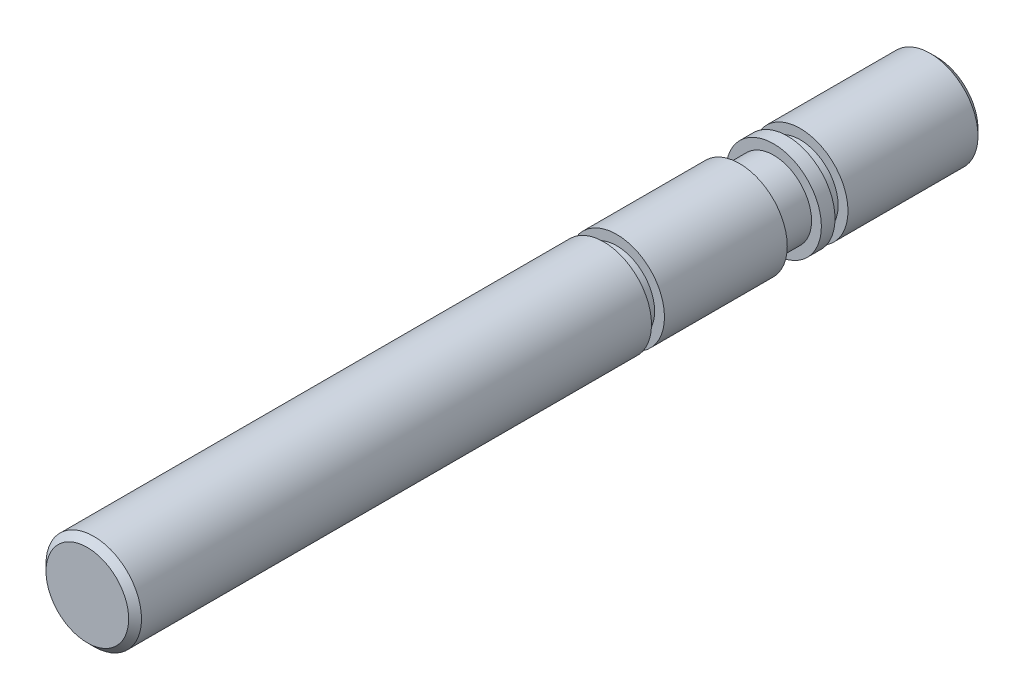
ISO-10303-21;
HEADER;
FILE_DESCRIPTION(('STEP AP214'),'2;1');
FILE_NAME('part.step','',(''),(''),'','','');
FILE_SCHEMA(('AUTOMOTIVE_DESIGN { 1 0 10303 214 1 1 1 1 }'));
ENDSEC;
DATA;
#1=APPLICATION_CONTEXT('core data for automotive mechanical design processes');
#2=APPLICATION_PROTOCOL_DEFINITION('international standard','automotive_design',2000,#1);
#3=PRODUCT_CONTEXT('',#1,'mechanical');
#4=PRODUCT('Part','Part','',(#3));
#5=PRODUCT_RELATED_PRODUCT_CATEGORY('part','',(#4));
#6=PRODUCT_DEFINITION_FORMATION('','',#4);
#7=PRODUCT_DEFINITION_CONTEXT('part definition',#1,'design');
#8=PRODUCT_DEFINITION('design','',#6,#7);
#9=PRODUCT_DEFINITION_SHAPE('','',#8);
#10=(LENGTH_UNIT() NAMED_UNIT(*) SI_UNIT(.MILLI.,.METRE.));
#11=(NAMED_UNIT(*) PLANE_ANGLE_UNIT() SI_UNIT($,.RADIAN.));
#12=(NAMED_UNIT(*) SI_UNIT($,.STERADIAN.) SOLID_ANGLE_UNIT());
#13=UNCERTAINTY_MEASURE_WITH_UNIT(LENGTH_MEASURE(1.E-05),#10,'distance_accuracy_value','');
#14=(GEOMETRIC_REPRESENTATION_CONTEXT(3) GLOBAL_UNCERTAINTY_ASSIGNED_CONTEXT((#13)) GLOBAL_UNIT_ASSIGNED_CONTEXT((#10,
#11,#12)) REPRESENTATION_CONTEXT('',''));
#15=CARTESIAN_POINT('',(0.,0.,0.));
#16=DIRECTION('',(0.,0.,1.));
#17=DIRECTION('',(1.,0.,0.));
#18=AXIS2_PLACEMENT_3D('',#15,#16,#17);
#19=CARTESIAN_POINT('',(-0.0295083440985239,7.,-29.25));
#20=DIRECTION('',(0.,0.,-1.));
#21=DIRECTION('',(0.,1.,0.));
#22=AXIS2_PLACEMENT_3D('',#19,#20,#21);
#23=PLANE('',#22);
#24=CARTESIAN_POINT('',(-0.0295083440985237,7.,-29.2499999999905));
#25=DIRECTION('',(0.,0.,1.));
#26=DIRECTION('',(1.,0.,0.));
#27=AXIS2_PLACEMENT_3D('',#24,#25,#26);
#28=CIRCLE('',#27,3.02950834440662);
#29=CARTESIAN_POINT('',(3.0000000003081,7.,-29.2499999999905));
#30=VERTEX_POINT('',#29);
#31=EDGE_CURVE('E17',#30,#30,#28,.T.);
#32=ORIENTED_EDGE('',*,*,#31,.F.);
#33=EDGE_LOOP('',(#32));
#34=FACE_BOUND('',#33,.T.);
#35=ADVANCED_FACE('F14',(#34),#23,.T.);
#36=CARTESIAN_POINT('',(-0.0295083440985239,7.,-28.7795083440869));
#37=DIRECTION('',(0.,0.,1.));
#38=DIRECTION('',(1.,0.,0.));
#39=AXIS2_PLACEMENT_3D('',#36,#37,#38);
#40=CONICAL_SURFACE('',#39,3.50000000031014,0.785398163397448);
#41=CARTESIAN_POINT('',(-0.0295083440985239,6.99999999999997,-28.7795083441275));
#42=DIRECTION('',(0.,0.,1.));
#43=DIRECTION('',(1.,0.,0.));
#44=AXIS2_PLACEMENT_3D('',#41,#42,#43);
#45=CIRCLE('',#44,3.50000000024676);
#46=CARTESIAN_POINT('',(3.47049165614824,6.99999999999997,-28.7795083441275));
#47=VERTEX_POINT('',#46);
#48=EDGE_CURVE('E30',#47,#47,#45,.T.);
#49=ORIENTED_EDGE('',*,*,#48,.F.);
#50=EDGE_LOOP('',(#49));
#51=FACE_BOUND('',#50,.T.);
#52=ORIENTED_EDGE('',*,*,#31,.T.);
#53=EDGE_LOOP('',(#52));
#54=FACE_BOUND('',#53,.T.);
#55=ADVANCED_FACE('F72',(#51,#54),#40,.T.);
#56=CARTESIAN_POINT('',(-0.0295083440985315,6.99999999999997,33.));
#57=DIRECTION('',(0.,0.,1.));
#58=DIRECTION('',(1.,0.,0.));
#59=AXIS2_PLACEMENT_3D('',#56,#57,#58);
#60=CYLINDRICAL_SURFACE('',#59,3.50000000024676);
#61=ORIENTED_EDGE('',*,*,#48,.T.);
#62=EDGE_LOOP('',(#61));
#63=FACE_BOUND('',#62,.T.);
#64=CARTESIAN_POINT('',(-0.0295083440985251,6.99999999999997,-19.250000000029));
#65=DIRECTION('',(0.,0.,1.));
#66=DIRECTION('',(1.,0.,0.));
#67=AXIS2_PLACEMENT_3D('',#64,#65,#66);
#68=CIRCLE('',#67,3.50000000024676);
#69=CARTESIAN_POINT('',(3.47049165614824,6.99999999999997,-19.250000000029));
#70=VERTEX_POINT('',#69);
#71=EDGE_CURVE('E62',#70,#70,#68,.T.);
#72=ORIENTED_EDGE('',*,*,#71,.F.);
#73=EDGE_LOOP('',(#72));
#74=FACE_BOUND('',#73,.T.);
#75=ADVANCED_FACE('F79',(#63,#74),#60,.T.);
#76=CARTESIAN_POINT('',(3.47049165614824,6.99999999999999,-19.250000000029));
#77=DIRECTION('',(0.,0.,1.));
#78=DIRECTION('',(0.,-1.,0.));
#79=AXIS2_PLACEMENT_3D('',#76,#77,#78);
#80=PLANE('',#79);
#81=CARTESIAN_POINT('',(-0.0295083440985251,6.99999999999997,-19.250000000029));
#82=DIRECTION('',(0.,0.,1.));
#83=DIRECTION('',(1.,0.,0.));
#84=AXIS2_PLACEMENT_3D('',#81,#82,#83);
#85=CIRCLE('',#84,2.7795083443453);
#86=CARTESIAN_POINT('',(2.75000000024677,6.99999999999997,-19.250000000029));
#87=VERTEX_POINT('',#86);
#88=EDGE_CURVE('E60',#87,#87,#85,.T.);
#89=ORIENTED_EDGE('',*,*,#88,.F.);
#90=EDGE_LOOP('',(#89));
#91=FACE_BOUND('',#90,.T.);
#92=ORIENTED_EDGE('',*,*,#71,.T.);
#93=EDGE_LOOP('',(#92));
#94=FACE_BOUND('',#93,.T.);
#95=ADVANCED_FACE('F135',(#91,#94),#80,.T.);
#96=CARTESIAN_POINT('',(-0.0295083440985315,6.99999999999997,33.));
#97=DIRECTION('',(0.,0.,1.));
#98=DIRECTION('',(1.,0.,0.));
#99=AXIS2_PLACEMENT_3D('',#96,#97,#98);
#100=CYLINDRICAL_SURFACE('',#99,2.7795083443453);
#101=ORIENTED_EDGE('',*,*,#88,.T.);
#102=EDGE_LOOP('',(#101));
#103=FACE_BOUND('',#102,.T.);
#104=CARTESIAN_POINT('',(-0.0295083440985252,6.99999999999997,-18.300000000029));
#105=DIRECTION('',(0.,0.,1.));
#106=DIRECTION('',(1.,0.,0.));
#107=AXIS2_PLACEMENT_3D('',#104,#105,#106);
#108=CIRCLE('',#107,2.7795083443453);
#109=CARTESIAN_POINT('',(2.75000000024677,6.99999999999997,-18.300000000029));
#110=VERTEX_POINT('',#109);
#111=EDGE_CURVE('E57',#110,#110,#108,.T.);
#112=ORIENTED_EDGE('',*,*,#111,.F.);
#113=EDGE_LOOP('',(#112));
#114=FACE_BOUND('',#113,.T.);
#115=ADVANCED_FACE('F131',(#103,#114),#100,.T.);
#116=CARTESIAN_POINT('',(2.75000000024677,6.99999999999999,-18.300000000029));
#117=DIRECTION('',(0.,0.,-1.));
#118=DIRECTION('',(0.,1.,0.));
#119=AXIS2_PLACEMENT_3D('',#116,#117,#118);
#120=PLANE('',#119);
#121=ORIENTED_EDGE('',*,*,#111,.T.);
#122=EDGE_LOOP('',(#121));
#123=FACE_BOUND('',#122,.T.);
#124=CARTESIAN_POINT('',(-0.0295083440985252,6.99999999999997,-18.300000000029));
#125=DIRECTION('',(0.,0.,1.));
#126=DIRECTION('',(1.,0.,0.));
#127=AXIS2_PLACEMENT_3D('',#124,#125,#126);
#128=CIRCLE('',#127,3.50000000024676);
#129=CARTESIAN_POINT('',(3.47049165614824,6.99999999999997,-18.300000000029));
#130=VERTEX_POINT('',#129);
#131=EDGE_CURVE('E54',#130,#130,#128,.T.);
#132=ORIENTED_EDGE('',*,*,#131,.F.);
#133=EDGE_LOOP('',(#132));
#134=FACE_BOUND('',#133,.T.);
#135=ADVANCED_FACE('F127',(#123,#134),#120,.T.);
#136=CARTESIAN_POINT('',(-0.0295083440985315,6.99999999999997,33.));
#137=DIRECTION('',(0.,0.,1.));
#138=DIRECTION('',(1.,0.,0.));
#139=AXIS2_PLACEMENT_3D('',#136,#137,#138);
#140=CYLINDRICAL_SURFACE('',#139,3.50000000024676);
#141=ORIENTED_EDGE('',*,*,#131,.T.);
#142=EDGE_LOOP('',(#141));
#143=FACE_BOUND('',#142,.T.);
#144=CARTESIAN_POINT('',(-0.0295083440985253,6.99999999999997,-17.300000000029));
#145=DIRECTION('',(0.,0.,1.));
#146=DIRECTION('',(1.,0.,0.));
#147=AXIS2_PLACEMENT_3D('',#144,#145,#146);
#148=CIRCLE('',#147,3.50000000024676);
#149=CARTESIAN_POINT('',(3.47049165614824,6.99999999999997,-17.300000000029));
#150=VERTEX_POINT('',#149);
#151=EDGE_CURVE('E51',#150,#150,#148,.T.);
#152=ORIENTED_EDGE('',*,*,#151,.F.);
#153=EDGE_LOOP('',(#152));
#154=FACE_BOUND('',#153,.T.);
#155=ADVANCED_FACE('F123',(#143,#154),#140,.T.);
#156=CARTESIAN_POINT('',(3.47049165614824,6.99999999999999,-17.300000000029));
#157=DIRECTION('',(0.,0.,1.));
#158=DIRECTION('',(0.,-1.,0.));
#159=AXIS2_PLACEMENT_3D('',#156,#157,#158);
#160=PLANE('',#159);
#161=CARTESIAN_POINT('',(-0.0295083440985253,6.99999999999997,-17.300000000029));
#162=DIRECTION('',(0.,0.,1.));
#163=DIRECTION('',(1.,0.,0.));
#164=AXIS2_PLACEMENT_3D('',#161,#162,#163);
#165=CIRCLE('',#164,2.7795083443453);
#166=CARTESIAN_POINT('',(2.75000000024677,6.99999999999997,-17.300000000029));
#167=VERTEX_POINT('',#166);
#168=EDGE_CURVE('E48',#167,#167,#165,.T.);
#169=ORIENTED_EDGE('',*,*,#168,.F.);
#170=EDGE_LOOP('',(#169));
#171=FACE_BOUND('',#170,.T.);
#172=ORIENTED_EDGE('',*,*,#151,.T.);
#173=EDGE_LOOP('',(#172));
#174=FACE_BOUND('',#173,.T.);
#175=ADVANCED_FACE('F119',(#171,#174),#160,.T.);
#176=CARTESIAN_POINT('',(-0.0295083440985315,6.99999999999997,33.));
#177=DIRECTION('',(0.,0.,1.));
#178=DIRECTION('',(1.,0.,0.));
#179=AXIS2_PLACEMENT_3D('',#176,#177,#178);
#180=CYLINDRICAL_SURFACE('',#179,2.7795083443453);
#181=ORIENTED_EDGE('',*,*,#168,.T.);
#182=EDGE_LOOP('',(#181));
#183=FACE_BOUND('',#182,.T.);
#184=CARTESIAN_POINT('',(-0.0295083440985256,6.99999999999997,-14.8000000000289));
#185=DIRECTION('',(0.,0.,1.));
#186=DIRECTION('',(1.,0.,0.));
#187=AXIS2_PLACEMENT_3D('',#184,#185,#186);
#188=CIRCLE('',#187,2.7795083443453);
#189=CARTESIAN_POINT('',(2.75000000024677,6.99999999999997,-14.8000000000289));
#190=VERTEX_POINT('',#189);
#191=EDGE_CURVE('E45',#190,#190,#188,.T.);
#192=ORIENTED_EDGE('',*,*,#191,.F.);
#193=EDGE_LOOP('',(#192));
#194=FACE_BOUND('',#193,.T.);
#195=ADVANCED_FACE('F115',(#183,#194),#180,.T.);
#196=CARTESIAN_POINT('',(2.75000000024677,6.99999999999999,-14.800000000029));
#197=DIRECTION('',(0.,0.,-1.));
#198=DIRECTION('',(0.,1.,0.));
#199=AXIS2_PLACEMENT_3D('',#196,#197,#198);
#200=PLANE('',#199);
#201=ORIENTED_EDGE('',*,*,#191,.T.);
#202=EDGE_LOOP('',(#201));
#203=FACE_BOUND('',#202,.T.);
#204=CARTESIAN_POINT('',(-0.0295083440985256,6.99999999999997,-14.8000000000289));
#205=DIRECTION('',(0.,0.,1.));
#206=DIRECTION('',(1.,0.,0.));
#207=AXIS2_PLACEMENT_3D('',#204,#205,#206);
#208=CIRCLE('',#207,3.50000000024677);
#209=CARTESIAN_POINT('',(3.47049165614824,6.99999999999997,-14.8000000000289));
#210=VERTEX_POINT('',#209);
#211=EDGE_CURVE('E42',#210,#210,#208,.T.);
#212=ORIENTED_EDGE('',*,*,#211,.F.);
#213=EDGE_LOOP('',(#212));
#214=FACE_BOUND('',#213,.T.);
#215=ADVANCED_FACE('F111',(#203,#214),#200,.T.);
#216=CARTESIAN_POINT('',(-0.0295083440985315,6.99999999999997,33.));
#217=DIRECTION('',(0.,0.,1.));
#218=DIRECTION('',(1.,0.,0.));
#219=AXIS2_PLACEMENT_3D('',#216,#217,#218);
#220=CYLINDRICAL_SURFACE('',#219,3.50000000024677);
#221=ORIENTED_EDGE('',*,*,#211,.T.);
#222=EDGE_LOOP('',(#221));
#223=FACE_BOUND('',#222,.T.);
#224=CARTESIAN_POINT('',(-0.0295083440985267,6.99999999999997,-5.80000000002894));
#225=DIRECTION('',(0.,0.,1.));
#226=DIRECTION('',(1.,0.,0.));
#227=AXIS2_PLACEMENT_3D('',#224,#225,#226);
#228=CIRCLE('',#227,3.50000000024677);
#229=CARTESIAN_POINT('',(3.47049165614824,6.99999999999997,-5.80000000002894));
#230=VERTEX_POINT('',#229);
#231=EDGE_CURVE('E39',#230,#230,#228,.T.);
#232=ORIENTED_EDGE('',*,*,#231,.F.);
#233=EDGE_LOOP('',(#232));
#234=FACE_BOUND('',#233,.T.);
#235=ADVANCED_FACE('F107',(#223,#234),#220,.T.);
#236=CARTESIAN_POINT('',(3.47049165614824,6.99999999999999,-5.80000000002894));
#237=DIRECTION('',(0.,0.,1.));
#238=DIRECTION('',(0.,-1.,0.));
#239=AXIS2_PLACEMENT_3D('',#236,#237,#238);
#240=PLANE('',#239);
#241=CARTESIAN_POINT('',(-0.0295083440985267,6.99999999999997,-5.80000000002894));
#242=DIRECTION('',(0.,0.,1.));
#243=DIRECTION('',(1.,0.,0.));
#244=AXIS2_PLACEMENT_3D('',#241,#242,#243);
#245=CIRCLE('',#244,2.7795083443453);
#246=CARTESIAN_POINT('',(2.75000000024677,6.99999999999997,-5.80000000002894));
#247=VERTEX_POINT('',#246);
#248=EDGE_CURVE('E36',#247,#247,#245,.T.);
#249=ORIENTED_EDGE('',*,*,#248,.F.);
#250=EDGE_LOOP('',(#249));
#251=FACE_BOUND('',#250,.T.);
#252=ORIENTED_EDGE('',*,*,#231,.T.);
#253=EDGE_LOOP('',(#252));
#254=FACE_BOUND('',#253,.T.);
#255=ADVANCED_FACE('F103',(#251,#254),#240,.T.);
#256=CARTESIAN_POINT('',(3.00000000027573,6.99999999999997,33.));
#257=DIRECTION('',(0.,0.,1.));
#258=DIRECTION('',(0.,-1.,0.));
#259=AXIS2_PLACEMENT_3D('',#256,#257,#258);
#260=PLANE('',#259);
#261=CARTESIAN_POINT('',(-0.0295083440985314,6.99999999999997,32.9999999999018));
#262=DIRECTION('',(0.,0.,-1.));
#263=DIRECTION('',(-1.,0.,0.));
#264=AXIS2_PLACEMENT_3D('',#261,#262,#263);
#265=CIRCLE('',#264,3.02950834441666);
#266=CARTESIAN_POINT('',(-3.05901668851519,6.99999999999997,32.9999999999018));
#267=VERTEX_POINT('',#266);
#268=EDGE_CURVE('E33',#267,#267,#265,.T.);
#269=ORIENTED_EDGE('',*,*,#268,.F.);
#270=EDGE_LOOP('',(#269));
#271=FACE_BOUND('',#270,.T.);
#272=ADVANCED_FACE('F99',(#271),#260,.T.);
#273=CARTESIAN_POINT('',(-0.0295083440985315,6.99999999999997,33.));
#274=DIRECTION('',(0.,0.,1.));
#275=DIRECTION('',(1.,0.,0.));
#276=AXIS2_PLACEMENT_3D('',#273,#274,#275);
#277=CYLINDRICAL_SURFACE('',#276,2.7795083443453);
#278=ORIENTED_EDGE('',*,*,#248,.T.);
#279=EDGE_LOOP('',(#278));
#280=FACE_BOUND('',#279,.T.);
#281=CARTESIAN_POINT('',(-0.0295083440985269,6.99999999999997,-4.85000000002894));
#282=DIRECTION('',(0.,0.,1.));
#283=DIRECTION('',(1.,0.,0.));
#284=AXIS2_PLACEMENT_3D('',#281,#282,#283);
#285=CIRCLE('',#284,2.7795083443453);
#286=CARTESIAN_POINT('',(2.75000000024677,6.99999999999997,-4.85000000002894));
#287=VERTEX_POINT('',#286);
#288=EDGE_CURVE('E26',#287,#287,#285,.T.);
#289=ORIENTED_EDGE('',*,*,#288,.F.);
#290=EDGE_LOOP('',(#289));
#291=FACE_BOUND('',#290,.T.);
#292=ADVANCED_FACE('F95',(#280,#291),#277,.T.);
#293=CARTESIAN_POINT('',(-0.0295083440985314,6.99999999999997,32.5295083441688));
#294=DIRECTION('',(0.,0.,-1.));
#295=DIRECTION('',(-1.,0.,0.));
#296=AXIS2_PLACEMENT_3D('',#293,#294,#295);
#297=CONICAL_SURFACE('',#296,3.50000000014964,0.785398163397448);
#298=ORIENTED_EDGE('',*,*,#268,.T.);
#299=EDGE_LOOP('',(#298));
#300=FACE_BOUND('',#299,.T.);
#301=CARTESIAN_POINT('',(-0.0295083440985314,6.99999999999997,32.5295083441275));
#302=DIRECTION('',(0.,0.,1.));
#303=DIRECTION('',(1.,0.,0.));
#304=AXIS2_PLACEMENT_3D('',#301,#302,#303);
#305=CIRCLE('',#304,3.50000000024677);
#306=CARTESIAN_POINT('',(3.47049165614824,6.99999999999997,32.5295083441275));
#307=VERTEX_POINT('',#306);
#308=EDGE_CURVE('E21',#307,#307,#305,.F.);
#309=ORIENTED_EDGE('',*,*,#308,.F.);
#310=EDGE_LOOP('',(#309));
#311=FACE_BOUND('',#310,.T.);
#312=ADVANCED_FACE('F89',(#300,#311),#297,.T.);
#313=CARTESIAN_POINT('',(2.75000000024677,6.99999999999999,-4.85000000002894));
#314=DIRECTION('',(0.,0.,-1.));
#315=DIRECTION('',(0.,1.,0.));
#316=AXIS2_PLACEMENT_3D('',#313,#314,#315);
#317=PLANE('',#316);
#318=ORIENTED_EDGE('',*,*,#288,.T.);
#319=EDGE_LOOP('',(#318));
#320=FACE_BOUND('',#319,.T.);
#321=CARTESIAN_POINT('',(-0.0295083440985269,6.99999999999997,-4.85000000002894));
#322=DIRECTION('',(0.,0.,1.));
#323=DIRECTION('',(1.,0.,0.));
#324=AXIS2_PLACEMENT_3D('',#321,#322,#323);
#325=CIRCLE('',#324,3.50000000024677);
#326=CARTESIAN_POINT('',(3.47049165614824,6.99999999999997,-4.85000000002894));
#327=VERTEX_POINT('',#326);
#328=EDGE_CURVE('E10',#327,#327,#325,.T.);
#329=ORIENTED_EDGE('',*,*,#328,.F.);
#330=EDGE_LOOP('',(#329));
#331=FACE_BOUND('',#330,.T.);
#332=ADVANCED_FACE('F83',(#320,#331),#317,.T.);
#333=CARTESIAN_POINT('',(-0.0295083440985315,6.99999999999997,33.));
#334=DIRECTION('',(0.,0.,1.));
#335=DIRECTION('',(1.,0.,0.));
#336=AXIS2_PLACEMENT_3D('',#333,#334,#335);
#337=CYLINDRICAL_SURFACE('',#336,3.50000000024677);
#338=ORIENTED_EDGE('',*,*,#308,.T.);
#339=EDGE_LOOP('',(#338));
#340=FACE_BOUND('',#339,.T.);
#341=ORIENTED_EDGE('',*,*,#328,.T.);
#342=EDGE_LOOP('',(#341));
#343=FACE_BOUND('',#342,.T.);
#344=ADVANCED_FACE('F81',(#340,#343),#337,.T.);
#345=CLOSED_SHELL('',(#35,#55,#75,#95,#115,#135,#155,#175,#195,#215,#235,#255,#272,#292,#312,
#332,#344));
#346=MANIFOLD_SOLID_BREP('B1',#345);
#347=ADVANCED_BREP_SHAPE_REPRESENTATION('',(#18,#346),#14);
#348=SHAPE_DEFINITION_REPRESENTATION(#9,#347);
ENDSEC;
END-ISO-10303-21;
